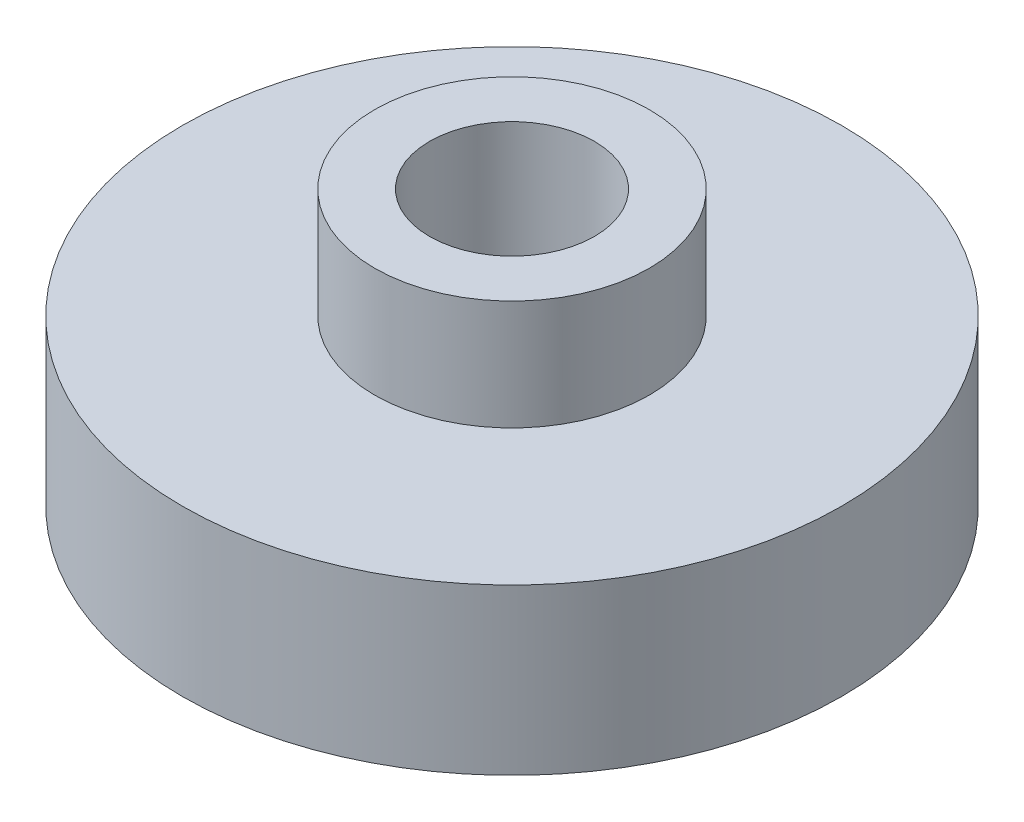
ISO-10303-21;
HEADER;
FILE_DESCRIPTION(('STEP AP214'),'2;1');
FILE_NAME('part.step','',(''),(''),'','','');
FILE_SCHEMA(('AUTOMOTIVE_DESIGN { 1 0 10303 214 1 1 1 1 }'));
ENDSEC;
DATA;
#1=APPLICATION_CONTEXT('core data for automotive mechanical design processes');
#2=APPLICATION_PROTOCOL_DEFINITION('international standard','automotive_design',2000,#1);
#3=PRODUCT_CONTEXT('',#1,'mechanical');
#4=PRODUCT('Part','Part','',(#3));
#5=PRODUCT_RELATED_PRODUCT_CATEGORY('part','',(#4));
#6=PRODUCT_DEFINITION_FORMATION('','',#4);
#7=PRODUCT_DEFINITION_CONTEXT('part definition',#1,'design');
#8=PRODUCT_DEFINITION('design','',#6,#7);
#9=PRODUCT_DEFINITION_SHAPE('','',#8);
#10=(LENGTH_UNIT() NAMED_UNIT(*) SI_UNIT(.MILLI.,.METRE.));
#11=(NAMED_UNIT(*) PLANE_ANGLE_UNIT() SI_UNIT($,.RADIAN.));
#12=(NAMED_UNIT(*) SI_UNIT($,.STERADIAN.) SOLID_ANGLE_UNIT());
#13=UNCERTAINTY_MEASURE_WITH_UNIT(LENGTH_MEASURE(1.E-05),#10,'distance_accuracy_value','');
#14=(GEOMETRIC_REPRESENTATION_CONTEXT(3) GLOBAL_UNCERTAINTY_ASSIGNED_CONTEXT((#13)) GLOBAL_UNIT_ASSIGNED_CONTEXT((#10,
#11,#12)) REPRESENTATION_CONTEXT('',''));
#15=CARTESIAN_POINT('',(0.,0.,0.));
#16=DIRECTION('',(0.,0.,1.));
#17=DIRECTION('',(1.,0.,0.));
#18=AXIS2_PLACEMENT_3D('',#15,#16,#17);
#19=CARTESIAN_POINT('',(0.,2.,0.));
#20=DIRECTION('',(0.,1.,0.));
#21=DIRECTION('',(0.,0.,1.));
#22=AXIS2_PLACEMENT_3D('',#19,#20,#21);
#23=PLANE('',#22);
#24=CARTESIAN_POINT('',(0.,2.,0.));
#25=DIRECTION('',(0.,1.,0.));
#26=DIRECTION('',(0.,0.,1.));
#27=AXIS2_PLACEMENT_3D('',#24,#25,#26);
#28=CIRCLE('',#27,2.5);
#29=CARTESIAN_POINT('',(0.,2.,2.5));
#30=VERTEX_POINT('',#29);
#31=EDGE_CURVE('E10',#30,#30,#28,.T.);
#32=ORIENTED_EDGE('',*,*,#31,.T.);
#33=EDGE_LOOP('',(#32));
#34=FACE_BOUND('',#33,.T.);
#35=CARTESIAN_POINT('',(0.,2.,0.));
#36=DIRECTION('',(0.,1.,0.));
#37=DIRECTION('',(0.,0.,1.));
#38=AXIS2_PLACEMENT_3D('',#35,#36,#37);
#39=CIRCLE('',#38,1.5);
#40=CARTESIAN_POINT('',(0.,2.,1.5));
#41=VERTEX_POINT('',#40);
#42=EDGE_CURVE('E50',#41,#41,#39,.T.);
#43=ORIENTED_EDGE('',*,*,#42,.F.);
#44=EDGE_LOOP('',(#43));
#45=FACE_BOUND('',#44,.T.);
#46=ADVANCED_FACE('F41',(#34,#45),#23,.T.);
#47=CARTESIAN_POINT('',(0.,2.,0.));
#48=DIRECTION('',(0.,-1.,0.));
#49=DIRECTION('',(0.,0.,-1.));
#50=AXIS2_PLACEMENT_3D('',#47,#48,#49);
#51=CYLINDRICAL_SURFACE('',#50,2.5);
#52=ORIENTED_EDGE('',*,*,#31,.F.);
#53=EDGE_LOOP('',(#52));
#54=FACE_BOUND('',#53,.T.);
#55=CARTESIAN_POINT('',(0.,0.,0.));
#56=DIRECTION('',(0.,1.,0.));
#57=DIRECTION('',(0.,0.,1.));
#58=AXIS2_PLACEMENT_3D('',#55,#56,#57);
#59=CIRCLE('',#58,2.5);
#60=CARTESIAN_POINT('',(0.,0.,2.5));
#61=VERTEX_POINT('',#60);
#62=EDGE_CURVE('E45',#61,#61,#59,.T.);
#63=ORIENTED_EDGE('',*,*,#62,.T.);
#64=EDGE_LOOP('',(#63));
#65=FACE_BOUND('',#64,.T.);
#66=ADVANCED_FACE('F43',(#54,#65),#51,.T.);
#67=CARTESIAN_POINT('',(0.,2.,0.));
#68=DIRECTION('',(0.,-1.,0.));
#69=DIRECTION('',(0.,0.,-1.));
#70=AXIS2_PLACEMENT_3D('',#67,#68,#69);
#71=CYLINDRICAL_SURFACE('',#70,1.5);
#72=ORIENTED_EDGE('',*,*,#42,.T.);
#73=EDGE_LOOP('',(#72));
#74=FACE_BOUND('',#73,.T.);
#75=CARTESIAN_POINT('',(0.,-3.,0.));
#76=DIRECTION('',(0.,-1.,0.));
#77=DIRECTION('',(0.,0.,-1.));
#78=AXIS2_PLACEMENT_3D('',#75,#76,#77);
#79=CIRCLE('',#78,1.5);
#80=CARTESIAN_POINT('',(0.,-3.,-1.5));
#81=VERTEX_POINT('',#80);
#82=EDGE_CURVE('E62',#81,#81,#79,.T.);
#83=ORIENTED_EDGE('',*,*,#82,.T.);
#84=EDGE_LOOP('',(#83));
#85=FACE_BOUND('',#84,.T.);
#86=ADVANCED_FACE('F70',(#74,#85),#71,.F.);
#87=CARTESIAN_POINT('',(0.,-3.,0.));
#88=DIRECTION('',(0.,-1.,0.));
#89=DIRECTION('',(0.,0.,-1.));
#90=AXIS2_PLACEMENT_3D('',#87,#88,#89);
#91=PLANE('',#90);
#92=CARTESIAN_POINT('',(0.,-3.,0.));
#93=DIRECTION('',(0.,-1.,0.));
#94=DIRECTION('',(0.,0.,-1.));
#95=AXIS2_PLACEMENT_3D('',#92,#93,#94);
#96=CIRCLE('',#95,6.);
#97=CARTESIAN_POINT('',(0.,-3.,-6.));
#98=VERTEX_POINT('',#97);
#99=EDGE_CURVE('E61',#98,#98,#96,.T.);
#100=ORIENTED_EDGE('',*,*,#99,.T.);
#101=EDGE_LOOP('',(#100));
#102=FACE_BOUND('',#101,.T.);
#103=ORIENTED_EDGE('',*,*,#82,.F.);
#104=EDGE_LOOP('',(#103));
#105=FACE_BOUND('',#104,.T.);
#106=ADVANCED_FACE('F72',(#102,#105),#91,.T.);
#107=CARTESIAN_POINT('',(0.,0.,0.));
#108=DIRECTION('',(0.,-1.,0.));
#109=DIRECTION('',(0.,0.,-1.));
#110=AXIS2_PLACEMENT_3D('',#107,#108,#109);
#111=PLANE('',#110);
#112=ORIENTED_EDGE('',*,*,#62,.F.);
#113=EDGE_LOOP('',(#112));
#114=FACE_BOUND('',#113,.T.);
#115=CARTESIAN_POINT('',(0.,0.,0.));
#116=DIRECTION('',(0.,-1.,0.));
#117=DIRECTION('',(0.,0.,-1.));
#118=AXIS2_PLACEMENT_3D('',#115,#116,#117);
#119=CIRCLE('',#118,6.);
#120=CARTESIAN_POINT('',(0.,0.,-6.));
#121=VERTEX_POINT('',#120);
#122=EDGE_CURVE('E57',#121,#121,#119,.T.);
#123=ORIENTED_EDGE('',*,*,#122,.F.);
#124=EDGE_LOOP('',(#123));
#125=FACE_BOUND('',#124,.T.);
#126=ADVANCED_FACE('F74',(#114,#125),#111,.F.);
#127=CARTESIAN_POINT('',(0.,-3.,0.));
#128=DIRECTION('',(0.,1.,0.));
#129=DIRECTION('',(0.,0.,1.));
#130=AXIS2_PLACEMENT_3D('',#127,#128,#129);
#131=CYLINDRICAL_SURFACE('',#130,6.);
#132=ORIENTED_EDGE('',*,*,#99,.F.);
#133=EDGE_LOOP('',(#132));
#134=FACE_BOUND('',#133,.T.);
#135=ORIENTED_EDGE('',*,*,#122,.T.);
#136=EDGE_LOOP('',(#135));
#137=FACE_BOUND('',#136,.T.);
#138=ADVANCED_FACE('F81',(#134,#137),#131,.T.);
#139=CLOSED_SHELL('',(#46,#66,#86,#106,#126,#138));
#140=MANIFOLD_SOLID_BREP('B2',#139);
#141=ADVANCED_BREP_SHAPE_REPRESENTATION('',(#18,#140),#14);
#142=SHAPE_DEFINITION_REPRESENTATION(#9,#141);
ENDSEC;
END-ISO-10303-21;
